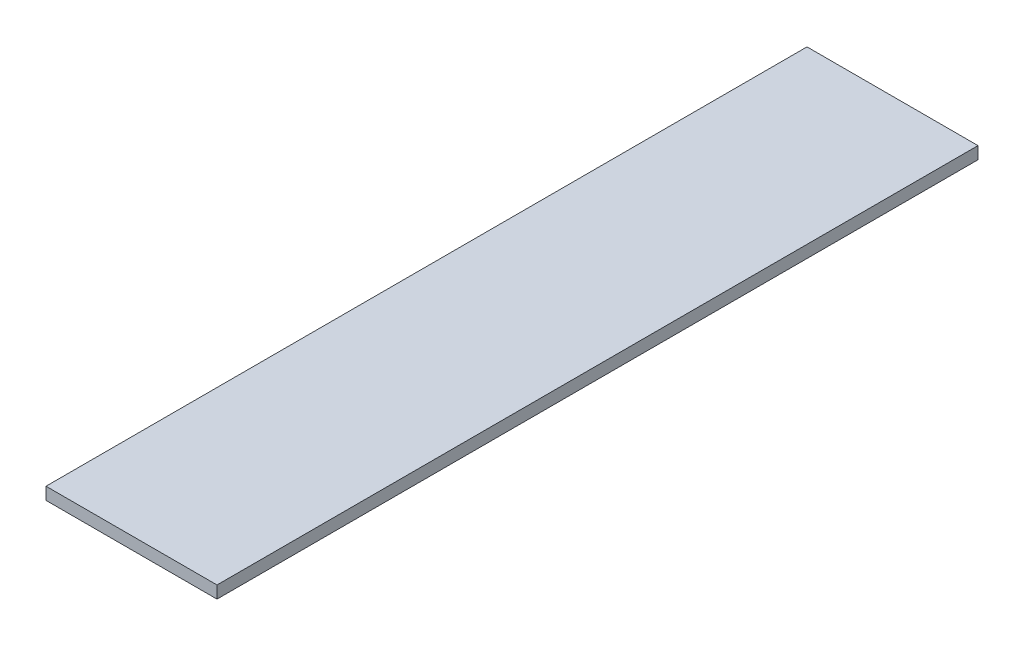
ISO-10303-21;
HEADER;
FILE_DESCRIPTION(('STEP AP214'),'2;1');
FILE_NAME('part.step','',(''),(''),'','','');
FILE_SCHEMA(('AUTOMOTIVE_DESIGN { 1 0 10303 214 1 1 1 1 }'));
ENDSEC;
DATA;
#1=APPLICATION_CONTEXT('core data for automotive mechanical design processes');
#2=APPLICATION_PROTOCOL_DEFINITION('international standard','automotive_design',2000,#1);
#3=PRODUCT_CONTEXT('',#1,'mechanical');
#4=PRODUCT('Part','Part','',(#3));
#5=PRODUCT_RELATED_PRODUCT_CATEGORY('part','',(#4));
#6=PRODUCT_DEFINITION_FORMATION('','',#4);
#7=PRODUCT_DEFINITION_CONTEXT('part definition',#1,'design');
#8=PRODUCT_DEFINITION('design','',#6,#7);
#9=PRODUCT_DEFINITION_SHAPE('','',#8);
#10=(LENGTH_UNIT() NAMED_UNIT(*) SI_UNIT(.MILLI.,.METRE.));
#11=(NAMED_UNIT(*) PLANE_ANGLE_UNIT() SI_UNIT($,.RADIAN.));
#12=(NAMED_UNIT(*) SI_UNIT($,.STERADIAN.) SOLID_ANGLE_UNIT());
#13=UNCERTAINTY_MEASURE_WITH_UNIT(LENGTH_MEASURE(1.E-05),#10,'distance_accuracy_value','');
#14=(GEOMETRIC_REPRESENTATION_CONTEXT(3) GLOBAL_UNCERTAINTY_ASSIGNED_CONTEXT((#13)) GLOBAL_UNIT_ASSIGNED_CONTEXT((#10,
#11,#12)) REPRESENTATION_CONTEXT('',''));
#15=CARTESIAN_POINT('',(0.,0.,0.));
#16=DIRECTION('',(0.,0.,1.));
#17=DIRECTION('',(1.,0.,0.));
#18=AXIS2_PLACEMENT_3D('',#15,#16,#17);
#19=CARTESIAN_POINT('',(-127.,18.25625,0.));
#20=DIRECTION('',(1.,0.,0.));
#21=DIRECTION('',(0.,0.,-1.));
#22=AXIS2_PLACEMENT_3D('',#19,#20,#21);
#23=PLANE('',#22);
#24=DIRECTION('',(0.,0.,1.));
#25=VECTOR('',#24,1.);
#26=CARTESIAN_POINT('',(-127.,0.,0.));
#27=LINE('',#26,#25);
#28=CARTESIAN_POINT('',(-127.,0.,0.));
#29=VERTEX_POINT('',#28);
#30=CARTESIAN_POINT('',(-127.,0.,1130.3));
#31=VERTEX_POINT('',#30);
#32=EDGE_CURVE('E95',#29,#31,#27,.T.);
#33=ORIENTED_EDGE('',*,*,#32,.T.);
#34=DIRECTION('',(0.,-1.,0.));
#35=VECTOR('',#34,1.);
#36=CARTESIAN_POINT('',(-127.,18.25625,1130.3));
#37=LINE('',#36,#35);
#38=CARTESIAN_POINT('',(-127.,18.25625,1130.3));
#39=VERTEX_POINT('',#38);
#40=EDGE_CURVE('E11',#39,#31,#37,.T.);
#41=ORIENTED_EDGE('',*,*,#40,.F.);
#42=DIRECTION('',(0.,0.,1.));
#43=VECTOR('',#42,1.);
#44=CARTESIAN_POINT('',(-127.,18.25625,0.));
#45=LINE('',#44,#43);
#46=CARTESIAN_POINT('',(-127.,18.25625,0.));
#47=VERTEX_POINT('',#46);
#48=EDGE_CURVE('E83',#47,#39,#45,.T.);
#49=ORIENTED_EDGE('',*,*,#48,.F.);
#50=DIRECTION('',(0.,-1.,0.));
#51=VECTOR('',#50,1.);
#52=CARTESIAN_POINT('',(-127.,18.25625,0.));
#53=LINE('',#52,#51);
#54=EDGE_CURVE('E91',#47,#29,#53,.T.);
#55=ORIENTED_EDGE('',*,*,#54,.T.);
#56=EDGE_LOOP('',(#33,#41,#49,#55));
#57=FACE_BOUND('',#56,.T.);
#58=ADVANCED_FACE('F32',(#57),#23,.F.);
#59=CARTESIAN_POINT('',(-127.,18.25625,1130.3));
#60=DIRECTION('',(0.,0.,-1.));
#61=DIRECTION('',(-1.,0.,0.));
#62=AXIS2_PLACEMENT_3D('',#59,#60,#61);
#63=PLANE('',#62);
#64=DIRECTION('',(1.,0.,0.));
#65=VECTOR('',#64,1.);
#66=CARTESIAN_POINT('',(-127.,0.,1130.3));
#67=LINE('',#66,#65);
#68=CARTESIAN_POINT('',(127.,0.,1130.3));
#69=VERTEX_POINT('',#68);
#70=EDGE_CURVE('E87',#31,#69,#67,.T.);
#71=ORIENTED_EDGE('',*,*,#70,.T.);
#72=DIRECTION('',(0.,-1.,0.));
#73=VECTOR('',#72,1.);
#74=CARTESIAN_POINT('',(127.,18.25625,1130.3));
#75=LINE('',#74,#73);
#76=CARTESIAN_POINT('',(127.,18.25625,1130.3));
#77=VERTEX_POINT('',#76);
#78=EDGE_CURVE('E40',#77,#69,#75,.T.);
#79=ORIENTED_EDGE('',*,*,#78,.F.);
#80=DIRECTION('',(1.,0.,0.));
#81=VECTOR('',#80,1.);
#82=CARTESIAN_POINT('',(-127.,18.25625,1130.3));
#83=LINE('',#82,#81);
#84=EDGE_CURVE('E78',#39,#77,#83,.T.);
#85=ORIENTED_EDGE('',*,*,#84,.F.);
#86=ORIENTED_EDGE('',*,*,#40,.T.);
#87=EDGE_LOOP('',(#71,#79,#85,#86));
#88=FACE_BOUND('',#87,.T.);
#89=ADVANCED_FACE('F86',(#88),#63,.F.);
#90=CARTESIAN_POINT('',(127.,18.25625,0.));
#91=DIRECTION('',(-1.,0.,0.));
#92=DIRECTION('',(0.,0.,1.));
#93=AXIS2_PLACEMENT_3D('',#90,#91,#92);
#94=PLANE('',#93);
#95=DIRECTION('',(0.,0.,-1.));
#96=VECTOR('',#95,1.);
#97=CARTESIAN_POINT('',(127.,0.,0.));
#98=LINE('',#97,#96);
#99=CARTESIAN_POINT('',(127.,0.,0.));
#100=VERTEX_POINT('',#99);
#101=EDGE_CURVE('E65',#69,#100,#98,.T.);
#102=ORIENTED_EDGE('',*,*,#101,.T.);
#103=DIRECTION('',(0.,-1.,0.));
#104=VECTOR('',#103,1.);
#105=CARTESIAN_POINT('',(127.,18.25625,0.));
#106=LINE('',#105,#104);
#107=CARTESIAN_POINT('',(127.,18.25625,0.));
#108=VERTEX_POINT('',#107);
#109=EDGE_CURVE('E88',#108,#100,#106,.T.);
#110=ORIENTED_EDGE('',*,*,#109,.F.);
#111=DIRECTION('',(0.,0.,-1.));
#112=VECTOR('',#111,1.);
#113=CARTESIAN_POINT('',(127.,18.25625,0.));
#114=LINE('',#113,#112);
#115=EDGE_CURVE('E81',#77,#108,#114,.T.);
#116=ORIENTED_EDGE('',*,*,#115,.F.);
#117=ORIENTED_EDGE('',*,*,#78,.T.);
#118=EDGE_LOOP('',(#102,#110,#116,#117));
#119=FACE_BOUND('',#118,.T.);
#120=ADVANCED_FACE('F89',(#119),#94,.F.);
#121=CARTESIAN_POINT('',(-127.,18.25625,0.));
#122=DIRECTION('',(0.,0.,1.));
#123=DIRECTION('',(1.,0.,0.));
#124=AXIS2_PLACEMENT_3D('',#121,#122,#123);
#125=PLANE('',#124);
#126=DIRECTION('',(-1.,0.,0.));
#127=VECTOR('',#126,1.);
#128=CARTESIAN_POINT('',(-127.,0.,0.));
#129=LINE('',#128,#127);
#130=EDGE_CURVE('E71',#100,#29,#129,.T.);
#131=ORIENTED_EDGE('',*,*,#130,.T.);
#132=ORIENTED_EDGE('',*,*,#54,.F.);
#133=DIRECTION('',(-1.,0.,0.));
#134=VECTOR('',#133,1.);
#135=CARTESIAN_POINT('',(-127.,18.25625,0.));
#136=LINE('',#135,#134);
#137=EDGE_CURVE('E48',#108,#47,#136,.T.);
#138=ORIENTED_EDGE('',*,*,#137,.F.);
#139=ORIENTED_EDGE('',*,*,#109,.T.);
#140=EDGE_LOOP('',(#131,#132,#138,#139));
#141=FACE_BOUND('',#140,.T.);
#142=ADVANCED_FACE('F102',(#141),#125,.F.);
#143=CARTESIAN_POINT('',(0.,18.25625,0.));
#144=DIRECTION('',(0.,1.,0.));
#145=DIRECTION('',(0.,0.,1.));
#146=AXIS2_PLACEMENT_3D('',#143,#144,#145);
#147=PLANE('',#146);
#148=ORIENTED_EDGE('',*,*,#48,.T.);
#149=ORIENTED_EDGE('',*,*,#84,.T.);
#150=ORIENTED_EDGE('',*,*,#115,.T.);
#151=ORIENTED_EDGE('',*,*,#137,.T.);
#152=EDGE_LOOP('',(#148,#149,#150,#151));
#153=FACE_BOUND('',#152,.T.);
#154=ADVANCED_FACE('F79',(#153),#147,.T.);
#155=CARTESIAN_POINT('',(0.,0.,0.));
#156=DIRECTION('',(0.,1.,0.));
#157=DIRECTION('',(0.,0.,1.));
#158=AXIS2_PLACEMENT_3D('',#155,#156,#157);
#159=PLANE('',#158);
#160=ORIENTED_EDGE('',*,*,#32,.F.);
#161=ORIENTED_EDGE('',*,*,#130,.F.);
#162=ORIENTED_EDGE('',*,*,#101,.F.);
#163=ORIENTED_EDGE('',*,*,#70,.F.);
#164=EDGE_LOOP('',(#160,#161,#162,#163));
#165=FACE_BOUND('',#164,.T.);
#166=ADVANCED_FACE('F105',(#165),#159,.F.);
#167=CLOSED_SHELL('',(#58,#89,#120,#142,#154,#166));
#168=MANIFOLD_SOLID_BREP('B2',#167);
#169=ADVANCED_BREP_SHAPE_REPRESENTATION('',(#18,#168),#14);
#170=SHAPE_DEFINITION_REPRESENTATION(#9,#169);
ENDSEC;
END-ISO-10303-21;
